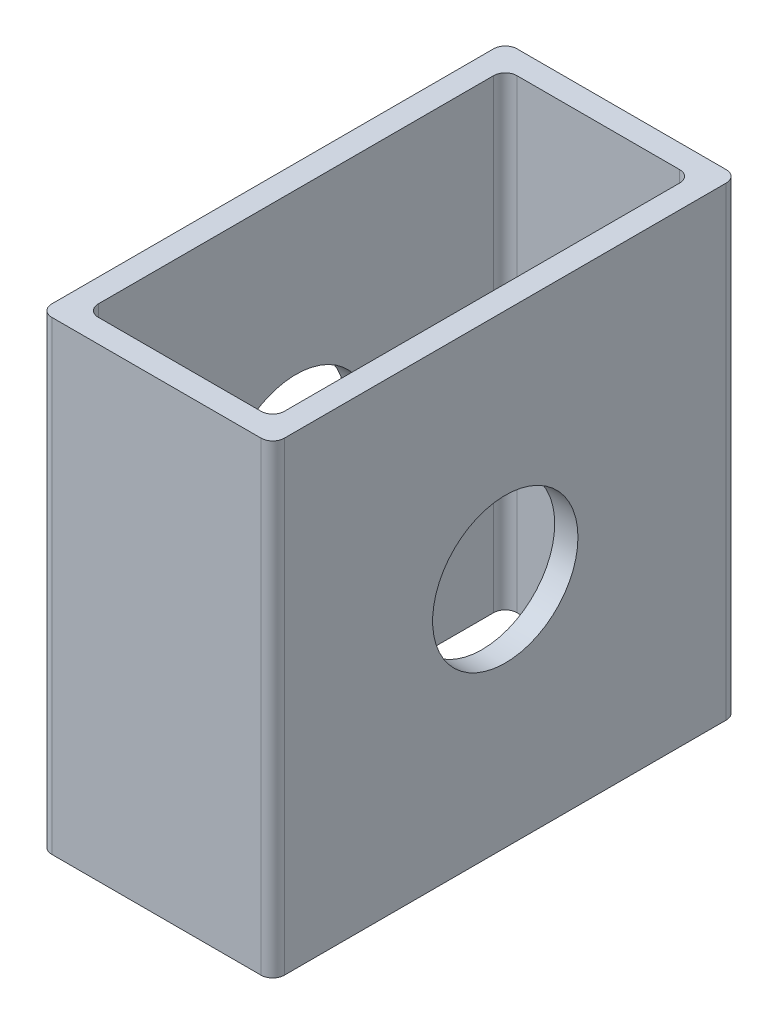
ISO-10303-21;
HEADER;
FILE_DESCRIPTION(('STEP AP214'),'2;1');
FILE_NAME('part.step','',(''),(''),'','','');
FILE_SCHEMA(('AUTOMOTIVE_DESIGN { 1 0 10303 214 1 1 1 1 }'));
ENDSEC;
DATA;
#1=APPLICATION_CONTEXT('core data for automotive mechanical design processes');
#2=APPLICATION_PROTOCOL_DEFINITION('international standard','automotive_design',2000,#1);
#3=PRODUCT_CONTEXT('',#1,'mechanical');
#4=PRODUCT('Part','Part','',(#3));
#5=PRODUCT_RELATED_PRODUCT_CATEGORY('part','',(#4));
#6=PRODUCT_DEFINITION_FORMATION('','',#4);
#7=PRODUCT_DEFINITION_CONTEXT('part definition',#1,'design');
#8=PRODUCT_DEFINITION('design','',#6,#7);
#9=PRODUCT_DEFINITION_SHAPE('','',#8);
#10=(LENGTH_UNIT() NAMED_UNIT(*) SI_UNIT(.MILLI.,.METRE.));
#11=(NAMED_UNIT(*) PLANE_ANGLE_UNIT() SI_UNIT($,.RADIAN.));
#12=(NAMED_UNIT(*) SI_UNIT($,.STERADIAN.) SOLID_ANGLE_UNIT());
#13=UNCERTAINTY_MEASURE_WITH_UNIT(LENGTH_MEASURE(1.E-05),#10,'distance_accuracy_value','');
#14=(GEOMETRIC_REPRESENTATION_CONTEXT(3) GLOBAL_UNCERTAINTY_ASSIGNED_CONTEXT((#13)) GLOBAL_UNIT_ASSIGNED_CONTEXT((#10,
#11,#12)) REPRESENTATION_CONTEXT('',''));
#15=CARTESIAN_POINT('',(0.,0.,0.));
#16=DIRECTION('',(0.,0.,1.));
#17=DIRECTION('',(1.,0.,0.));
#18=AXIS2_PLACEMENT_3D('',#15,#16,#17);
#19=CARTESIAN_POINT('',(2.,705.,-2.));
#20=DIRECTION('',(0.,-1.,0.));
#21=DIRECTION('',(0.,0.,-1.));
#22=AXIS2_PLACEMENT_3D('',#19,#20,#21);
#23=CYLINDRICAL_SURFACE('',#22,2.);
#24=CARTESIAN_POINT('',(2.,625.,-2.));
#25=DIRECTION('',(0.,-1.,0.));
#26=DIRECTION('',(0.,0.,-1.));
#27=AXIS2_PLACEMENT_3D('',#24,#25,#26);
#28=CIRCLE('',#27,2.);
#29=CARTESIAN_POINT('',(2.00000000000001,625.,0.));
#30=VERTEX_POINT('',#29);
#31=CARTESIAN_POINT('',(0.,625.,-2.00000000000001));
#32=VERTEX_POINT('',#31);
#33=EDGE_CURVE('E48',#30,#32,#28,.T.);
#34=ORIENTED_EDGE('',*,*,#33,.F.);
#35=DIRECTION('',(0.,-1.,0.));
#36=VECTOR('',#35,1.);
#37=CARTESIAN_POINT('',(2.00000000000001,705.,0.));
#38=LINE('',#37,#36);
#39=CARTESIAN_POINT('',(2.00000000000001,705.,0.));
#40=VERTEX_POINT('',#39);
#41=EDGE_CURVE('E41',#40,#30,#38,.T.);
#42=ORIENTED_EDGE('',*,*,#41,.F.);
#43=CARTESIAN_POINT('',(2.,705.,-2.));
#44=DIRECTION('',(0.,1.,0.));
#45=DIRECTION('',(0.,0.,-1.));
#46=AXIS2_PLACEMENT_3D('',#43,#44,#45);
#47=CIRCLE('',#46,2.);
#48=CARTESIAN_POINT('',(0.,705.,-2.00000000000001));
#49=VERTEX_POINT('',#48);
#50=EDGE_CURVE('E240',#49,#40,#47,.T.);
#51=ORIENTED_EDGE('',*,*,#50,.F.);
#52=DIRECTION('',(0.,-1.,0.));
#53=VECTOR('',#52,1.);
#54=CARTESIAN_POINT('',(0.,705.,-2.00000000000001));
#55=LINE('',#54,#53);
#56=EDGE_CURVE('E256',#49,#32,#55,.T.);
#57=ORIENTED_EDGE('',*,*,#56,.T.);
#58=EDGE_LOOP('',(#34,#42,#51,#57));
#59=FACE_BOUND('',#58,.T.);
#60=ADVANCED_FACE('F34',(#59),#23,.T.);
#61=CARTESIAN_POINT('',(2.00000000000001,705.,0.));
#62=DIRECTION('',(0.,0.,-1.));
#63=DIRECTION('',(-1.,0.,0.));
#64=AXIS2_PLACEMENT_3D('',#61,#62,#63);
#65=PLANE('',#64);
#66=DIRECTION('',(1.,0.,0.));
#67=VECTOR('',#66,1.);
#68=CARTESIAN_POINT('',(0.,625.,0.));
#69=LINE('',#68,#67);
#70=CARTESIAN_POINT('',(38.,625.,0.));
#71=VERTEX_POINT('',#70);
#72=EDGE_CURVE('E271',#30,#71,#69,.T.);
#73=ORIENTED_EDGE('',*,*,#72,.T.);
#74=DIRECTION('',(0.,-1.,0.));
#75=VECTOR('',#74,1.);
#76=CARTESIAN_POINT('',(38.,705.,0.));
#77=LINE('',#76,#75);
#78=CARTESIAN_POINT('',(38.,705.,0.));
#79=VERTEX_POINT('',#78);
#80=EDGE_CURVE('E172',#79,#71,#77,.T.);
#81=ORIENTED_EDGE('',*,*,#80,.F.);
#82=DIRECTION('',(1.,0.,0.));
#83=VECTOR('',#82,1.);
#84=CARTESIAN_POINT('',(2.00000000000001,705.,0.));
#85=LINE('',#84,#83);
#86=EDGE_CURVE('E243',#40,#79,#85,.T.);
#87=ORIENTED_EDGE('',*,*,#86,.F.);
#88=ORIENTED_EDGE('',*,*,#41,.T.);
#89=EDGE_LOOP('',(#73,#81,#87,#88));
#90=FACE_BOUND('',#89,.T.);
#91=ADVANCED_FACE('F299',(#90),#65,.F.);
#92=CARTESIAN_POINT('',(38.,705.,-2.));
#93=DIRECTION('',(0.,-1.,0.));
#94=DIRECTION('',(0.,0.,-1.));
#95=AXIS2_PLACEMENT_3D('',#92,#93,#94);
#96=CYLINDRICAL_SURFACE('',#95,2.);
#97=CARTESIAN_POINT('',(38.,625.,-2.));
#98=DIRECTION('',(0.,-1.,0.));
#99=DIRECTION('',(0.,0.,-1.));
#100=AXIS2_PLACEMENT_3D('',#97,#98,#99);
#101=CIRCLE('',#100,2.);
#102=CARTESIAN_POINT('',(40.,625.,-2.00000000000002));
#103=VERTEX_POINT('',#102);
#104=EDGE_CURVE('E154',#103,#71,#101,.T.);
#105=ORIENTED_EDGE('',*,*,#104,.F.);
#106=DIRECTION('',(0.,-1.,0.));
#107=VECTOR('',#106,1.);
#108=CARTESIAN_POINT('',(40.,705.,-2.00000000000001));
#109=LINE('',#108,#107);
#110=CARTESIAN_POINT('',(40.,705.,-2.00000000000001));
#111=VERTEX_POINT('',#110);
#112=EDGE_CURVE('E165',#111,#103,#109,.T.);
#113=ORIENTED_EDGE('',*,*,#112,.F.);
#114=CARTESIAN_POINT('',(38.,705.,-2.));
#115=DIRECTION('',(0.,1.,0.));
#116=DIRECTION('',(0.,0.,-1.));
#117=AXIS2_PLACEMENT_3D('',#114,#115,#116);
#118=CIRCLE('',#117,2.);
#119=EDGE_CURVE('E245',#79,#111,#118,.T.);
#120=ORIENTED_EDGE('',*,*,#119,.F.);
#121=ORIENTED_EDGE('',*,*,#80,.T.);
#122=EDGE_LOOP('',(#105,#113,#120,#121));
#123=FACE_BOUND('',#122,.T.);
#124=ADVANCED_FACE('F302',(#123),#96,.T.);
#125=CARTESIAN_POINT('',(40.,705.,-2.00000000000001));
#126=DIRECTION('',(-1.,0.,0.));
#127=DIRECTION('',(0.,0.,1.));
#128=AXIS2_PLACEMENT_3D('',#125,#126,#127);
#129=PLANE('',#128);
#130=CARTESIAN_POINT('',(40.,665.,-40.));
#131=DIRECTION('',(1.,0.,0.));
#132=DIRECTION('',(0.,0.,-1.));
#133=AXIS2_PLACEMENT_3D('',#130,#131,#132);
#134=CIRCLE('',#133,12.5);
#135=CARTESIAN_POINT('',(40.,665.,-52.5));
#136=VERTEX_POINT('',#135);
#137=EDGE_CURVE('E191',#136,#136,#134,.T.);
#138=ORIENTED_EDGE('',*,*,#137,.F.);
#139=EDGE_LOOP('',(#138));
#140=FACE_BOUND('',#139,.T.);
#141=DIRECTION('',(0.,0.,1.));
#142=VECTOR('',#141,1.);
#143=CARTESIAN_POINT('',(40.,625.,-80.));
#144=LINE('',#143,#142);
#145=CARTESIAN_POINT('',(40.,625.,-78.));
#146=VERTEX_POINT('',#145);
#147=EDGE_CURVE('E146',#146,#103,#144,.T.);
#148=ORIENTED_EDGE('',*,*,#147,.F.);
#149=DIRECTION('',(0.,-1.,0.));
#150=VECTOR('',#149,1.);
#151=CARTESIAN_POINT('',(40.,705.,-78.));
#152=LINE('',#151,#150);
#153=CARTESIAN_POINT('',(40.,705.,-78.));
#154=VERTEX_POINT('',#153);
#155=EDGE_CURVE('E162',#154,#146,#152,.T.);
#156=ORIENTED_EDGE('',*,*,#155,.F.);
#157=DIRECTION('',(0.,0.,-1.));
#158=VECTOR('',#157,1.);
#159=CARTESIAN_POINT('',(40.,705.,-2.00000000000001));
#160=LINE('',#159,#158);
#161=EDGE_CURVE('E247',#111,#154,#160,.T.);
#162=ORIENTED_EDGE('',*,*,#161,.F.);
#163=ORIENTED_EDGE('',*,*,#112,.T.);
#164=EDGE_LOOP('',(#148,#156,#162,#163));
#165=FACE_BOUND('',#164,.T.);
#166=ADVANCED_FACE('F160',(#140,#165),#129,.F.);
#167=CARTESIAN_POINT('',(38.,705.,-78.));
#168=DIRECTION('',(0.,-1.,0.));
#169=DIRECTION('',(0.,0.,-1.));
#170=AXIS2_PLACEMENT_3D('',#167,#168,#169);
#171=CYLINDRICAL_SURFACE('',#170,2.);
#172=CARTESIAN_POINT('',(38.,625.,-78.));
#173=DIRECTION('',(0.,-1.,0.));
#174=DIRECTION('',(0.,0.,-1.));
#175=AXIS2_PLACEMENT_3D('',#172,#173,#174);
#176=CIRCLE('',#175,2.);
#177=CARTESIAN_POINT('',(38.,625.,-80.));
#178=VERTEX_POINT('',#177);
#179=EDGE_CURVE('E143',#178,#146,#176,.T.);
#180=ORIENTED_EDGE('',*,*,#179,.F.);
#181=DIRECTION('',(0.,-1.,0.));
#182=VECTOR('',#181,1.);
#183=CARTESIAN_POINT('',(38.,705.,-80.));
#184=LINE('',#183,#182);
#185=CARTESIAN_POINT('',(38.,705.,-80.));
#186=VERTEX_POINT('',#185);
#187=EDGE_CURVE('E170',#186,#178,#184,.T.);
#188=ORIENTED_EDGE('',*,*,#187,.F.);
#189=CARTESIAN_POINT('',(38.,705.,-78.));
#190=DIRECTION('',(0.,1.,0.));
#191=DIRECTION('',(0.,0.,-1.));
#192=AXIS2_PLACEMENT_3D('',#189,#190,#191);
#193=CIRCLE('',#192,2.);
#194=EDGE_CURVE('E169',#154,#186,#193,.T.);
#195=ORIENTED_EDGE('',*,*,#194,.F.);
#196=ORIENTED_EDGE('',*,*,#155,.T.);
#197=EDGE_LOOP('',(#180,#188,#195,#196));
#198=FACE_BOUND('',#197,.T.);
#199=ADVANCED_FACE('F168',(#198),#171,.T.);
#200=CARTESIAN_POINT('',(2.,705.,-80.));
#201=DIRECTION('',(0.,0.,1.));
#202=DIRECTION('',(1.,0.,0.));
#203=AXIS2_PLACEMENT_3D('',#200,#201,#202);
#204=PLANE('',#203);
#205=DIRECTION('',(1.,0.,0.));
#206=VECTOR('',#205,1.);
#207=CARTESIAN_POINT('',(0.,625.,-80.));
#208=LINE('',#207,#206);
#209=CARTESIAN_POINT('',(2.,625.,-80.));
#210=VERTEX_POINT('',#209);
#211=EDGE_CURVE('E149',#210,#178,#208,.T.);
#212=ORIENTED_EDGE('',*,*,#211,.F.);
#213=DIRECTION('',(0.,-1.,0.));
#214=VECTOR('',#213,1.);
#215=CARTESIAN_POINT('',(2.,705.,-80.));
#216=LINE('',#215,#214);
#217=CARTESIAN_POINT('',(2.,705.,-80.));
#218=VERTEX_POINT('',#217);
#219=EDGE_CURVE('E174',#218,#210,#216,.T.);
#220=ORIENTED_EDGE('',*,*,#219,.F.);
#221=DIRECTION('',(-1.,0.,0.));
#222=VECTOR('',#221,1.);
#223=CARTESIAN_POINT('',(2.,705.,-80.));
#224=LINE('',#223,#222);
#225=EDGE_CURVE('E250',#186,#218,#224,.T.);
#226=ORIENTED_EDGE('',*,*,#225,.F.);
#227=ORIENTED_EDGE('',*,*,#187,.T.);
#228=EDGE_LOOP('',(#212,#220,#226,#227));
#229=FACE_BOUND('',#228,.T.);
#230=ADVANCED_FACE('F270',(#229),#204,.F.);
#231=CARTESIAN_POINT('',(2.,705.,-78.));
#232=DIRECTION('',(0.,-1.,0.));
#233=DIRECTION('',(0.,0.,-1.));
#234=AXIS2_PLACEMENT_3D('',#231,#232,#233);
#235=CYLINDRICAL_SURFACE('',#234,2.);
#236=CARTESIAN_POINT('',(2.,625.,-78.));
#237=DIRECTION('',(0.,-1.,0.));
#238=DIRECTION('',(0.,0.,-1.));
#239=AXIS2_PLACEMENT_3D('',#236,#237,#238);
#240=CIRCLE('',#239,2.);
#241=CARTESIAN_POINT('',(0.,625.,-78.));
#242=VERTEX_POINT('',#241);
#243=EDGE_CURVE('E155',#242,#210,#240,.T.);
#244=ORIENTED_EDGE('',*,*,#243,.F.);
#245=DIRECTION('',(0.,-1.,0.));
#246=VECTOR('',#245,1.);
#247=CARTESIAN_POINT('',(0.,705.,-78.));
#248=LINE('',#247,#246);
#249=CARTESIAN_POINT('',(0.,705.,-78.));
#250=VERTEX_POINT('',#249);
#251=EDGE_CURVE('E259',#250,#242,#248,.T.);
#252=ORIENTED_EDGE('',*,*,#251,.F.);
#253=CARTESIAN_POINT('',(2.,705.,-78.));
#254=DIRECTION('',(0.,1.,0.));
#255=DIRECTION('',(0.,0.,-1.));
#256=AXIS2_PLACEMENT_3D('',#253,#254,#255);
#257=CIRCLE('',#256,2.);
#258=EDGE_CURVE('E252',#218,#250,#257,.T.);
#259=ORIENTED_EDGE('',*,*,#258,.F.);
#260=ORIENTED_EDGE('',*,*,#219,.T.);
#261=EDGE_LOOP('',(#244,#252,#259,#260));
#262=FACE_BOUND('',#261,.T.);
#263=ADVANCED_FACE('F266',(#262),#235,.T.);
#264=CARTESIAN_POINT('',(0.,705.,-2.00000000000001));
#265=DIRECTION('',(1.,0.,0.));
#266=DIRECTION('',(0.,0.,-1.));
#267=AXIS2_PLACEMENT_3D('',#264,#265,#266);
#268=PLANE('',#267);
#269=CARTESIAN_POINT('',(0.,665.,-40.));
#270=DIRECTION('',(1.,0.,0.));
#271=DIRECTION('',(0.,0.,-1.));
#272=AXIS2_PLACEMENT_3D('',#269,#270,#271);
#273=CIRCLE('',#272,12.5);
#274=CARTESIAN_POINT('',(0.,665.,-52.5));
#275=VERTEX_POINT('',#274);
#276=EDGE_CURVE('E184',#275,#275,#273,.T.);
#277=ORIENTED_EDGE('',*,*,#276,.T.);
#278=EDGE_LOOP('',(#277));
#279=FACE_BOUND('',#278,.T.);
#280=DIRECTION('',(0.,0.,1.));
#281=VECTOR('',#280,1.);
#282=CARTESIAN_POINT('',(0.,625.,-80.));
#283=LINE('',#282,#281);
#284=EDGE_CURVE('E166',#242,#32,#283,.T.);
#285=ORIENTED_EDGE('',*,*,#284,.T.);
#286=ORIENTED_EDGE('',*,*,#56,.F.);
#287=DIRECTION('',(0.,0.,1.));
#288=VECTOR('',#287,1.);
#289=CARTESIAN_POINT('',(0.,705.,-2.00000000000001));
#290=LINE('',#289,#288);
#291=EDGE_CURVE('E254',#250,#49,#290,.T.);
#292=ORIENTED_EDGE('',*,*,#291,.F.);
#293=ORIENTED_EDGE('',*,*,#251,.T.);
#294=EDGE_LOOP('',(#285,#286,#292,#293));
#295=FACE_BOUND('',#294,.T.);
#296=ADVANCED_FACE('F311',(#279,#295),#268,.F.);
#297=CARTESIAN_POINT('',(34.,705.,-6.));
#298=DIRECTION('',(0.,-1.,0.));
#299=DIRECTION('',(0.,0.,-1.));
#300=AXIS2_PLACEMENT_3D('',#297,#298,#299);
#301=CYLINDRICAL_SURFACE('',#300,2.);
#302=DIRECTION('',(0.,-1.,0.));
#303=VECTOR('',#302,1.);
#304=CARTESIAN_POINT('',(36.,705.,-6.00000000000001));
#305=LINE('',#304,#303);
#306=CARTESIAN_POINT('',(36.,705.,-6.00000000000001));
#307=VERTEX_POINT('',#306);
#308=CARTESIAN_POINT('',(36.,625.,-6.00000000000001));
#309=VERTEX_POINT('',#308);
#310=EDGE_CURVE('E237',#307,#309,#305,.T.);
#311=ORIENTED_EDGE('',*,*,#310,.T.);
#312=CARTESIAN_POINT('',(34.,625.,-6.));
#313=DIRECTION('',(0.,-1.,0.));
#314=DIRECTION('',(0.,0.,-1.));
#315=AXIS2_PLACEMENT_3D('',#312,#313,#314);
#316=CIRCLE('',#315,2.);
#317=CARTESIAN_POINT('',(34.,625.,-4.));
#318=VERTEX_POINT('',#317);
#319=EDGE_CURVE('E293',#309,#318,#316,.T.);
#320=ORIENTED_EDGE('',*,*,#319,.T.);
#321=DIRECTION('',(0.,-1.,0.));
#322=VECTOR('',#321,1.);
#323=CARTESIAN_POINT('',(34.,705.,-4.));
#324=LINE('',#323,#322);
#325=CARTESIAN_POINT('',(34.,705.,-4.));
#326=VERTEX_POINT('',#325);
#327=EDGE_CURVE('E216',#326,#318,#324,.T.);
#328=ORIENTED_EDGE('',*,*,#327,.F.);
#329=CARTESIAN_POINT('',(34.,705.,-6.));
#330=DIRECTION('',(0.,1.,0.));
#331=DIRECTION('',(0.,0.,1.));
#332=AXIS2_PLACEMENT_3D('',#329,#330,#331);
#333=CIRCLE('',#332,2.);
#334=EDGE_CURVE('E188',#326,#307,#333,.T.);
#335=ORIENTED_EDGE('',*,*,#334,.T.);
#336=EDGE_LOOP('',(#311,#320,#328,#335));
#337=FACE_BOUND('',#336,.T.);
#338=ADVANCED_FACE('F313',(#337),#301,.F.);
#339=CARTESIAN_POINT('',(36.,705.,-6.00000000000001));
#340=DIRECTION('',(-1.,0.,0.));
#341=DIRECTION('',(0.,0.,1.));
#342=AXIS2_PLACEMENT_3D('',#339,#340,#341);
#343=PLANE('',#342);
#344=CARTESIAN_POINT('',(36.,665.,-40.));
#345=DIRECTION('',(-1.,0.,0.));
#346=DIRECTION('',(0.,0.,1.));
#347=AXIS2_PLACEMENT_3D('',#344,#345,#346);
#348=CIRCLE('',#347,12.5);
#349=CARTESIAN_POINT('',(36.,665.,-27.5));
#350=VERTEX_POINT('',#349);
#351=EDGE_CURVE('E183',#350,#350,#348,.T.);
#352=ORIENTED_EDGE('',*,*,#351,.F.);
#353=EDGE_LOOP('',(#352));
#354=FACE_BOUND('',#353,.T.);
#355=DIRECTION('',(0.,-1.,0.));
#356=VECTOR('',#355,1.);
#357=CARTESIAN_POINT('',(36.,705.,-74.));
#358=LINE('',#357,#356);
#359=CARTESIAN_POINT('',(36.,705.,-74.));
#360=VERTEX_POINT('',#359);
#361=CARTESIAN_POINT('',(36.,625.,-74.));
#362=VERTEX_POINT('',#361);
#363=EDGE_CURVE('E234',#360,#362,#358,.T.);
#364=ORIENTED_EDGE('',*,*,#363,.T.);
#365=DIRECTION('',(0.,0.,1.));
#366=VECTOR('',#365,1.);
#367=CARTESIAN_POINT('',(36.,625.,-6.00000000000001));
#368=LINE('',#367,#366);
#369=EDGE_CURVE('E290',#362,#309,#368,.T.);
#370=ORIENTED_EDGE('',*,*,#369,.T.);
#371=ORIENTED_EDGE('',*,*,#310,.F.);
#372=DIRECTION('',(0.,0.,-1.));
#373=VECTOR('',#372,1.);
#374=CARTESIAN_POINT('',(36.,705.,-6.00000000000001));
#375=LINE('',#374,#373);
#376=EDGE_CURVE('E201',#307,#360,#375,.T.);
#377=ORIENTED_EDGE('',*,*,#376,.T.);
#378=EDGE_LOOP('',(#364,#370,#371,#377));
#379=FACE_BOUND('',#378,.T.);
#380=ADVANCED_FACE('F319',(#354,#379),#343,.T.);
#381=CARTESIAN_POINT('',(34.,705.,-74.));
#382=DIRECTION('',(0.,-1.,0.));
#383=DIRECTION('',(0.,0.,-1.));
#384=AXIS2_PLACEMENT_3D('',#381,#382,#383);
#385=CYLINDRICAL_SURFACE('',#384,2.);
#386=DIRECTION('',(0.,-1.,0.));
#387=VECTOR('',#386,1.);
#388=CARTESIAN_POINT('',(34.,705.,-76.));
#389=LINE('',#388,#387);
#390=CARTESIAN_POINT('',(34.,705.,-76.));
#391=VERTEX_POINT('',#390);
#392=CARTESIAN_POINT('',(34.,625.,-76.));
#393=VERTEX_POINT('',#392);
#394=EDGE_CURVE('E231',#391,#393,#389,.T.);
#395=ORIENTED_EDGE('',*,*,#394,.T.);
#396=CARTESIAN_POINT('',(34.,625.,-74.));
#397=DIRECTION('',(0.,-1.,0.));
#398=DIRECTION('',(0.,0.,-1.));
#399=AXIS2_PLACEMENT_3D('',#396,#397,#398);
#400=CIRCLE('',#399,2.);
#401=EDGE_CURVE('E287',#393,#362,#400,.T.);
#402=ORIENTED_EDGE('',*,*,#401,.T.);
#403=ORIENTED_EDGE('',*,*,#363,.F.);
#404=CARTESIAN_POINT('',(34.,705.,-74.));
#405=DIRECTION('',(0.,1.,0.));
#406=DIRECTION('',(0.,0.,1.));
#407=AXIS2_PLACEMENT_3D('',#404,#405,#406);
#408=CIRCLE('',#407,2.);
#409=EDGE_CURVE('E203',#360,#391,#408,.T.);
#410=ORIENTED_EDGE('',*,*,#409,.T.);
#411=EDGE_LOOP('',(#395,#402,#403,#410));
#412=FACE_BOUND('',#411,.T.);
#413=ADVANCED_FACE('F369',(#412),#385,.F.);
#414=CARTESIAN_POINT('',(6.,705.,-76.));
#415=DIRECTION('',(0.,0.,1.));
#416=DIRECTION('',(1.,0.,0.));
#417=AXIS2_PLACEMENT_3D('',#414,#415,#416);
#418=PLANE('',#417);
#419=DIRECTION('',(0.,-1.,0.));
#420=VECTOR('',#419,1.);
#421=CARTESIAN_POINT('',(6.,705.,-76.));
#422=LINE('',#421,#420);
#423=CARTESIAN_POINT('',(6.,705.,-76.));
#424=VERTEX_POINT('',#423);
#425=CARTESIAN_POINT('',(6.,625.,-76.));
#426=VERTEX_POINT('',#425);
#427=EDGE_CURVE('E228',#424,#426,#422,.T.);
#428=ORIENTED_EDGE('',*,*,#427,.T.);
#429=DIRECTION('',(1.,0.,0.));
#430=VECTOR('',#429,1.);
#431=CARTESIAN_POINT('',(6.,625.,-76.));
#432=LINE('',#431,#430);
#433=EDGE_CURVE('E284',#426,#393,#432,.T.);
#434=ORIENTED_EDGE('',*,*,#433,.T.);
#435=ORIENTED_EDGE('',*,*,#394,.F.);
#436=DIRECTION('',(-1.,0.,0.));
#437=VECTOR('',#436,1.);
#438=CARTESIAN_POINT('',(6.,705.,-76.));
#439=LINE('',#438,#437);
#440=EDGE_CURVE('E205',#391,#424,#439,.T.);
#441=ORIENTED_EDGE('',*,*,#440,.T.);
#442=EDGE_LOOP('',(#428,#434,#435,#441));
#443=FACE_BOUND('',#442,.T.);
#444=ADVANCED_FACE('F379',(#443),#418,.T.);
#445=CARTESIAN_POINT('',(6.,705.,-74.));
#446=DIRECTION('',(0.,-1.,0.));
#447=DIRECTION('',(0.,0.,-1.));
#448=AXIS2_PLACEMENT_3D('',#445,#446,#447);
#449=CYLINDRICAL_SURFACE('',#448,2.);
#450=DIRECTION('',(0.,-1.,0.));
#451=VECTOR('',#450,1.);
#452=CARTESIAN_POINT('',(4.,705.,-74.));
#453=LINE('',#452,#451);
#454=CARTESIAN_POINT('',(4.,705.,-74.));
#455=VERTEX_POINT('',#454);
#456=CARTESIAN_POINT('',(4.,625.,-74.));
#457=VERTEX_POINT('',#456);
#458=EDGE_CURVE('E225',#455,#457,#453,.T.);
#459=ORIENTED_EDGE('',*,*,#458,.T.);
#460=CARTESIAN_POINT('',(6.,625.,-74.));
#461=DIRECTION('',(0.,-1.,0.));
#462=DIRECTION('',(0.,0.,-1.));
#463=AXIS2_PLACEMENT_3D('',#460,#461,#462);
#464=CIRCLE('',#463,2.);
#465=EDGE_CURVE('E281',#457,#426,#464,.T.);
#466=ORIENTED_EDGE('',*,*,#465,.T.);
#467=ORIENTED_EDGE('',*,*,#427,.F.);
#468=CARTESIAN_POINT('',(6.,705.,-74.));
#469=DIRECTION('',(0.,1.,0.));
#470=DIRECTION('',(0.,0.,1.));
#471=AXIS2_PLACEMENT_3D('',#468,#469,#470);
#472=CIRCLE('',#471,2.);
#473=EDGE_CURVE('E207',#424,#455,#472,.T.);
#474=ORIENTED_EDGE('',*,*,#473,.T.);
#475=EDGE_LOOP('',(#459,#466,#467,#474));
#476=FACE_BOUND('',#475,.T.);
#477=ADVANCED_FACE('F389',(#476),#449,.F.);
#478=CARTESIAN_POINT('',(4.,705.,-6.00000000000001));
#479=DIRECTION('',(1.,0.,0.));
#480=DIRECTION('',(0.,0.,-1.));
#481=AXIS2_PLACEMENT_3D('',#478,#479,#480);
#482=PLANE('',#481);
#483=CARTESIAN_POINT('',(4.,665.,-40.));
#484=DIRECTION('',(1.,0.,0.));
#485=DIRECTION('',(0.,0.,-1.));
#486=AXIS2_PLACEMENT_3D('',#483,#484,#485);
#487=CIRCLE('',#486,12.5);
#488=CARTESIAN_POINT('',(4.,665.,-52.5));
#489=VERTEX_POINT('',#488);
#490=EDGE_CURVE('E181',#489,#489,#487,.T.);
#491=ORIENTED_EDGE('',*,*,#490,.F.);
#492=EDGE_LOOP('',(#491));
#493=FACE_BOUND('',#492,.T.);
#494=DIRECTION('',(0.,-1.,0.));
#495=VECTOR('',#494,1.);
#496=CARTESIAN_POINT('',(4.,705.,-6.00000000000002));
#497=LINE('',#496,#495);
#498=CARTESIAN_POINT('',(4.,705.,-6.00000000000002));
#499=VERTEX_POINT('',#498);
#500=CARTESIAN_POINT('',(4.,625.,-6.00000000000002));
#501=VERTEX_POINT('',#500);
#502=EDGE_CURVE('E222',#499,#501,#497,.T.);
#503=ORIENTED_EDGE('',*,*,#502,.T.);
#504=DIRECTION('',(0.,0.,-1.));
#505=VECTOR('',#504,1.);
#506=CARTESIAN_POINT('',(4.,625.,-6.00000000000001));
#507=LINE('',#506,#505);
#508=EDGE_CURVE('E278',#501,#457,#507,.T.);
#509=ORIENTED_EDGE('',*,*,#508,.T.);
#510=ORIENTED_EDGE('',*,*,#458,.F.);
#511=DIRECTION('',(0.,0.,1.));
#512=VECTOR('',#511,1.);
#513=CARTESIAN_POINT('',(4.,705.,-6.00000000000001));
#514=LINE('',#513,#512);
#515=EDGE_CURVE('E209',#455,#499,#514,.T.);
#516=ORIENTED_EDGE('',*,*,#515,.T.);
#517=EDGE_LOOP('',(#503,#509,#510,#516));
#518=FACE_BOUND('',#517,.T.);
#519=ADVANCED_FACE('F399',(#493,#518),#482,.T.);
#520=CARTESIAN_POINT('',(6.,705.,-6.));
#521=DIRECTION('',(0.,-1.,0.));
#522=DIRECTION('',(0.,0.,-1.));
#523=AXIS2_PLACEMENT_3D('',#520,#521,#522);
#524=CYLINDRICAL_SURFACE('',#523,2.);
#525=DIRECTION('',(0.,-1.,0.));
#526=VECTOR('',#525,1.);
#527=CARTESIAN_POINT('',(6.00000000000001,705.,-4.));
#528=LINE('',#527,#526);
#529=CARTESIAN_POINT('',(6.00000000000001,705.,-4.));
#530=VERTEX_POINT('',#529);
#531=CARTESIAN_POINT('',(6.00000000000001,625.,-4.));
#532=VERTEX_POINT('',#531);
#533=EDGE_CURVE('E219',#530,#532,#528,.T.);
#534=ORIENTED_EDGE('',*,*,#533,.T.);
#535=CARTESIAN_POINT('',(6.,625.,-6.));
#536=DIRECTION('',(0.,-1.,0.));
#537=DIRECTION('',(0.,0.,-1.));
#538=AXIS2_PLACEMENT_3D('',#535,#536,#537);
#539=CIRCLE('',#538,2.);
#540=EDGE_CURVE('E56',#532,#501,#539,.T.);
#541=ORIENTED_EDGE('',*,*,#540,.T.);
#542=ORIENTED_EDGE('',*,*,#502,.F.);
#543=CARTESIAN_POINT('',(6.,705.,-6.));
#544=DIRECTION('',(0.,1.,0.));
#545=DIRECTION('',(0.,0.,1.));
#546=AXIS2_PLACEMENT_3D('',#543,#544,#545);
#547=CIRCLE('',#546,2.);
#548=EDGE_CURVE('E211',#499,#530,#547,.T.);
#549=ORIENTED_EDGE('',*,*,#548,.T.);
#550=EDGE_LOOP('',(#534,#541,#542,#549));
#551=FACE_BOUND('',#550,.T.);
#552=ADVANCED_FACE('F409',(#551),#524,.F.);
#553=CARTESIAN_POINT('',(6.00000000000001,705.,-4.));
#554=DIRECTION('',(0.,0.,-1.));
#555=DIRECTION('',(-1.,0.,0.));
#556=AXIS2_PLACEMENT_3D('',#553,#554,#555);
#557=PLANE('',#556);
#558=ORIENTED_EDGE('',*,*,#327,.T.);
#559=DIRECTION('',(-1.,0.,0.));
#560=VECTOR('',#559,1.);
#561=CARTESIAN_POINT('',(6.00000000000001,625.,-4.));
#562=LINE('',#561,#560);
#563=EDGE_CURVE('E11',#318,#532,#562,.T.);
#564=ORIENTED_EDGE('',*,*,#563,.T.);
#565=ORIENTED_EDGE('',*,*,#533,.F.);
#566=DIRECTION('',(1.,0.,0.));
#567=VECTOR('',#566,1.);
#568=CARTESIAN_POINT('',(6.00000000000001,705.,-4.));
#569=LINE('',#568,#567);
#570=EDGE_CURVE('E214',#530,#326,#569,.T.);
#571=ORIENTED_EDGE('',*,*,#570,.T.);
#572=EDGE_LOOP('',(#558,#564,#565,#571));
#573=FACE_BOUND('',#572,.T.);
#574=ADVANCED_FACE('F419',(#573),#557,.T.);
#575=CARTESIAN_POINT('',(2.,705.,-2.));
#576=DIRECTION('',(0.,-1.,0.));
#577=DIRECTION('',(0.,0.,-1.));
#578=AXIS2_PLACEMENT_3D('',#575,#576,#577);
#579=PLANE('',#578);
#580=ORIENTED_EDGE('',*,*,#50,.T.);
#581=ORIENTED_EDGE('',*,*,#86,.T.);
#582=ORIENTED_EDGE('',*,*,#119,.T.);
#583=ORIENTED_EDGE('',*,*,#161,.T.);
#584=ORIENTED_EDGE('',*,*,#194,.T.);
#585=ORIENTED_EDGE('',*,*,#225,.T.);
#586=ORIENTED_EDGE('',*,*,#258,.T.);
#587=ORIENTED_EDGE('',*,*,#291,.T.);
#588=EDGE_LOOP('',(#580,#581,#582,#583,#584,#585,#586,#587));
#589=FACE_BOUND('',#588,.T.);
#590=ORIENTED_EDGE('',*,*,#334,.F.);
#591=ORIENTED_EDGE('',*,*,#570,.F.);
#592=ORIENTED_EDGE('',*,*,#548,.F.);
#593=ORIENTED_EDGE('',*,*,#515,.F.);
#594=ORIENTED_EDGE('',*,*,#473,.F.);
#595=ORIENTED_EDGE('',*,*,#440,.F.);
#596=ORIENTED_EDGE('',*,*,#409,.F.);
#597=ORIENTED_EDGE('',*,*,#376,.F.);
#598=EDGE_LOOP('',(#590,#591,#592,#593,#594,#595,#596,#597));
#599=FACE_BOUND('',#598,.T.);
#600=ADVANCED_FACE('F304',(#589,#599),#579,.F.);
#601=CARTESIAN_POINT('',(0.,665.,-40.));
#602=DIRECTION('',(1.,0.,0.));
#603=DIRECTION('',(0.,0.,-1.));
#604=AXIS2_PLACEMENT_3D('',#601,#602,#603);
#605=CYLINDRICAL_SURFACE('',#604,12.5);
#606=ORIENTED_EDGE('',*,*,#490,.T.);
#607=EDGE_LOOP('',(#606));
#608=FACE_BOUND('',#607,.T.);
#609=ORIENTED_EDGE('',*,*,#276,.F.);
#610=EDGE_LOOP('',(#609));
#611=FACE_BOUND('',#610,.T.);
#612=ADVANCED_FACE('F439',(#608,#611),#605,.F.);
#613=ORIENTED_EDGE('',*,*,#351,.T.);
#614=EDGE_LOOP('',(#613));
#615=FACE_BOUND('',#614,.T.);
#616=ORIENTED_EDGE('',*,*,#137,.T.);
#617=EDGE_LOOP('',(#616));
#618=FACE_BOUND('',#617,.T.);
#619=ADVANCED_FACE('F435',(#615,#618),#605,.F.);
#620=CARTESIAN_POINT('',(0.,625.,-80.));
#621=DIRECTION('',(0.,-1.,0.));
#622=DIRECTION('',(0.,0.,-1.));
#623=AXIS2_PLACEMENT_3D('',#620,#621,#622);
#624=PLANE('',#623);
#625=ORIENTED_EDGE('',*,*,#369,.F.);
#626=ORIENTED_EDGE('',*,*,#401,.F.);
#627=ORIENTED_EDGE('',*,*,#433,.F.);
#628=ORIENTED_EDGE('',*,*,#465,.F.);
#629=ORIENTED_EDGE('',*,*,#508,.F.);
#630=ORIENTED_EDGE('',*,*,#540,.F.);
#631=ORIENTED_EDGE('',*,*,#563,.F.);
#632=ORIENTED_EDGE('',*,*,#319,.F.);
#633=EDGE_LOOP('',(#625,#626,#627,#628,#629,#630,#631,#632));
#634=FACE_BOUND('',#633,.T.);
#635=ORIENTED_EDGE('',*,*,#33,.T.);
#636=ORIENTED_EDGE('',*,*,#284,.F.);
#637=ORIENTED_EDGE('',*,*,#243,.T.);
#638=ORIENTED_EDGE('',*,*,#211,.T.);
#639=ORIENTED_EDGE('',*,*,#179,.T.);
#640=ORIENTED_EDGE('',*,*,#147,.T.);
#641=ORIENTED_EDGE('',*,*,#104,.T.);
#642=ORIENTED_EDGE('',*,*,#72,.F.);
#643=EDGE_LOOP('',(#635,#636,#637,#638,#639,#640,#641,#642));
#644=FACE_BOUND('',#643,.T.);
#645=ADVANCED_FACE('F145',(#634,#644),#624,.T.);
#646=CLOSED_SHELL('',(#60,#91,#124,#166,#199,#230,#263,#296,#338,#380,#413,#444,#477,#519,#552,
#574,#600,#612,#619,#645));
#647=MANIFOLD_SOLID_BREP('B2',#646);
#648=ADVANCED_BREP_SHAPE_REPRESENTATION('',(#18,#647),#14);
#649=SHAPE_DEFINITION_REPRESENTATION(#9,#648);
ENDSEC;
END-ISO-10303-21;
